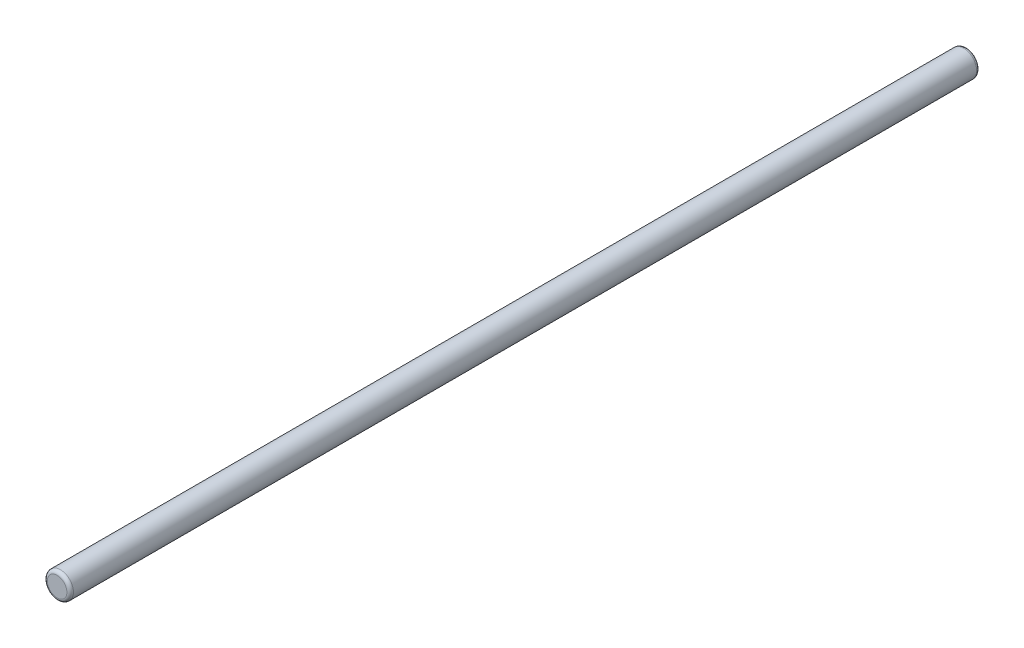
ISO-10303-21;
HEADER;
FILE_DESCRIPTION(('STEP AP214'),'2;1');
FILE_NAME('part.step','',(''),(''),'','','');
FILE_SCHEMA(('AUTOMOTIVE_DESIGN { 1 0 10303 214 1 1 1 1 }'));
ENDSEC;
DATA;
#1=APPLICATION_CONTEXT('core data for automotive mechanical design processes');
#2=APPLICATION_PROTOCOL_DEFINITION('international standard','automotive_design',2000,#1);
#3=PRODUCT_CONTEXT('',#1,'mechanical');
#4=PRODUCT('Part','Part','',(#3));
#5=PRODUCT_RELATED_PRODUCT_CATEGORY('part','',(#4));
#6=PRODUCT_DEFINITION_FORMATION('','',#4);
#7=PRODUCT_DEFINITION_CONTEXT('part definition',#1,'design');
#8=PRODUCT_DEFINITION('design','',#6,#7);
#9=PRODUCT_DEFINITION_SHAPE('','',#8);
#10=(LENGTH_UNIT() NAMED_UNIT(*) SI_UNIT(.MILLI.,.METRE.));
#11=(NAMED_UNIT(*) PLANE_ANGLE_UNIT() SI_UNIT($,.RADIAN.));
#12=(NAMED_UNIT(*) SI_UNIT($,.STERADIAN.) SOLID_ANGLE_UNIT());
#13=UNCERTAINTY_MEASURE_WITH_UNIT(LENGTH_MEASURE(1.E-05),#10,'distance_accuracy_value','');
#14=(GEOMETRIC_REPRESENTATION_CONTEXT(3) GLOBAL_UNCERTAINTY_ASSIGNED_CONTEXT((#13)) GLOBAL_UNIT_ASSIGNED_CONTEXT((#10,
#11,#12)) REPRESENTATION_CONTEXT('',''));
#15=CARTESIAN_POINT('',(0.,0.,0.));
#16=DIRECTION('',(0.,0.,1.));
#17=DIRECTION('',(1.,0.,0.));
#18=AXIS2_PLACEMENT_3D('',#15,#16,#17);
#19=CARTESIAN_POINT('',(0.,0.,69.977));
#20=DIRECTION('',(0.,0.,-1.));
#21=DIRECTION('',(-1.,0.,0.));
#22=AXIS2_PLACEMENT_3D('',#19,#20,#21);
#23=CYLINDRICAL_SURFACE('',#22,1.00457);
#24=CARTESIAN_POINT('',(0.,0.,0.254000000000004));
#25=DIRECTION('',(0.,0.,1.));
#26=DIRECTION('',(1.,0.,0.));
#27=AXIS2_PLACEMENT_3D('',#24,#25,#26);
#28=CIRCLE('',#27,1.00457);
#29=CARTESIAN_POINT('',(1.00457,0.,0.254000000000004));
#30=VERTEX_POINT('',#29);
#31=EDGE_CURVE('E48',#30,#30,#28,.T.);
#32=ORIENTED_EDGE('',*,*,#31,.T.);
#33=EDGE_LOOP('',(#32));
#34=FACE_BOUND('',#33,.T.);
#35=CARTESIAN_POINT('',(0.,0.,69.723));
#36=DIRECTION('',(0.,0.,1.));
#37=DIRECTION('',(1.,0.,0.));
#38=AXIS2_PLACEMENT_3D('',#35,#36,#37);
#39=CIRCLE('',#38,1.00457);
#40=CARTESIAN_POINT('',(1.00457,0.,69.723));
#41=VERTEX_POINT('',#40);
#42=EDGE_CURVE('E52',#41,#41,#39,.F.);
#43=ORIENTED_EDGE('',*,*,#42,.T.);
#44=EDGE_LOOP('',(#43));
#45=FACE_BOUND('',#44,.T.);
#46=ADVANCED_FACE('F37',(#34,#45),#23,.T.);
#47=CARTESIAN_POINT('',(0.,0.,69.977));
#48=DIRECTION('',(0.,0.,1.));
#49=DIRECTION('',(1.,0.,0.));
#50=AXIS2_PLACEMENT_3D('',#47,#48,#49);
#51=PLANE('',#50);
#52=CARTESIAN_POINT('',(0.,0.,69.977));
#53=DIRECTION('',(0.,0.,1.));
#54=DIRECTION('',(1.,0.,0.));
#55=AXIS2_PLACEMENT_3D('',#52,#53,#54);
#56=CIRCLE('',#55,0.75057);
#57=CARTESIAN_POINT('',(0.75057,0.,69.977));
#58=VERTEX_POINT('',#57);
#59=EDGE_CURVE('E10',#58,#58,#56,.T.);
#60=ORIENTED_EDGE('',*,*,#59,.T.);
#61=EDGE_LOOP('',(#60));
#62=FACE_BOUND('',#61,.T.);
#63=ADVANCED_FACE('F68',(#62),#51,.T.);
#64=CARTESIAN_POINT('',(0.,0.,0.));
#65=DIRECTION('',(0.,0.,1.));
#66=DIRECTION('',(1.,0.,0.));
#67=AXIS2_PLACEMENT_3D('',#64,#65,#66);
#68=PLANE('',#67);
#69=CARTESIAN_POINT('',(0.,0.,0.));
#70=DIRECTION('',(0.,0.,1.));
#71=DIRECTION('',(1.,0.,0.));
#72=AXIS2_PLACEMENT_3D('',#69,#70,#71);
#73=CIRCLE('',#72,0.75057);
#74=CARTESIAN_POINT('',(0.75057,0.,0.));
#75=VERTEX_POINT('',#74);
#76=EDGE_CURVE('E44',#75,#75,#73,.F.);
#77=ORIENTED_EDGE('',*,*,#76,.T.);
#78=EDGE_LOOP('',(#77));
#79=FACE_BOUND('',#78,.T.);
#80=ADVANCED_FACE('F65',(#79),#68,.F.);
#81=CARTESIAN_POINT('',(0.,0.,0.254000000000004));
#82=DIRECTION('',(0.,0.,1.));
#83=DIRECTION('',(1.,0.,0.));
#84=AXIS2_PLACEMENT_3D('',#81,#82,#83);
#85=TOROIDAL_SURFACE('',#84,0.75057,0.254);
#86=ORIENTED_EDGE('',*,*,#76,.F.);
#87=EDGE_LOOP('',(#86));
#88=FACE_BOUND('',#87,.T.);
#89=ORIENTED_EDGE('',*,*,#31,.F.);
#90=EDGE_LOOP('',(#89));
#91=FACE_BOUND('',#90,.T.);
#92=ADVANCED_FACE('F61',(#88,#91),#85,.T.);
#93=CARTESIAN_POINT('',(0.,0.,69.723));
#94=DIRECTION('',(0.,0.,1.));
#95=DIRECTION('',(1.,0.,0.));
#96=AXIS2_PLACEMENT_3D('',#93,#94,#95);
#97=TOROIDAL_SURFACE('',#96,0.75057,0.254);
#98=ORIENTED_EDGE('',*,*,#42,.F.);
#99=EDGE_LOOP('',(#98));
#100=FACE_BOUND('',#99,.T.);
#101=ORIENTED_EDGE('',*,*,#59,.F.);
#102=EDGE_LOOP('',(#101));
#103=FACE_BOUND('',#102,.T.);
#104=ADVANCED_FACE('F39',(#100,#103),#97,.T.);
#105=CLOSED_SHELL('',(#46,#63,#80,#92,#104));
#106=MANIFOLD_SOLID_BREP('B2',#105);
#107=ADVANCED_BREP_SHAPE_REPRESENTATION('',(#18,#106),#14);
#108=SHAPE_DEFINITION_REPRESENTATION(#9,#107);
ENDSEC;
END-ISO-10303-21;
